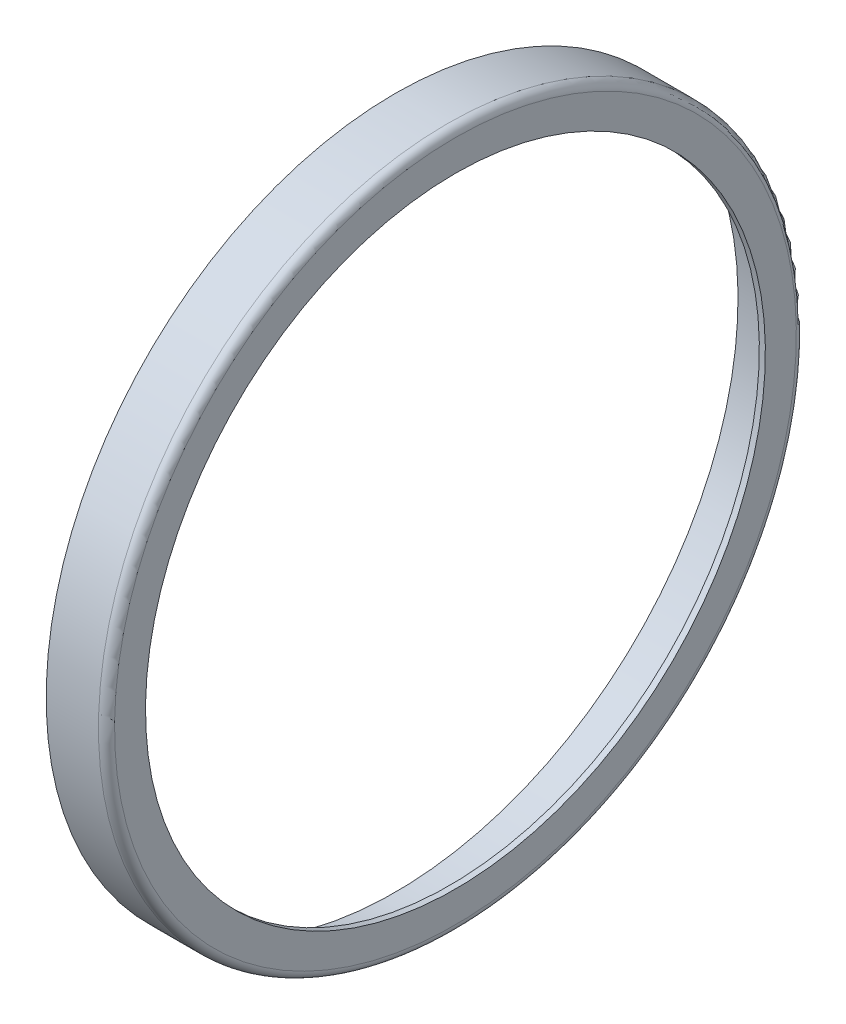
ISO-10303-21;
HEADER;
FILE_DESCRIPTION(('STEP AP214'),'2;1');
FILE_NAME('part.step','',(''),(''),'','','');
FILE_SCHEMA(('AUTOMOTIVE_DESIGN { 1 0 10303 214 1 1 1 1 }'));
ENDSEC;
DATA;
#1=APPLICATION_CONTEXT('core data for automotive mechanical design processes');
#2=APPLICATION_PROTOCOL_DEFINITION('international standard','automotive_design',2000,#1);
#3=PRODUCT_CONTEXT('',#1,'mechanical');
#4=PRODUCT('Part','Part','',(#3));
#5=PRODUCT_RELATED_PRODUCT_CATEGORY('part','',(#4));
#6=PRODUCT_DEFINITION_FORMATION('','',#4);
#7=PRODUCT_DEFINITION_CONTEXT('part definition',#1,'design');
#8=PRODUCT_DEFINITION('design','',#6,#7);
#9=PRODUCT_DEFINITION_SHAPE('','',#8);
#10=(LENGTH_UNIT() NAMED_UNIT(*) SI_UNIT(.MILLI.,.METRE.));
#11=(NAMED_UNIT(*) PLANE_ANGLE_UNIT() SI_UNIT($,.RADIAN.));
#12=(NAMED_UNIT(*) SI_UNIT($,.STERADIAN.) SOLID_ANGLE_UNIT());
#13=UNCERTAINTY_MEASURE_WITH_UNIT(LENGTH_MEASURE(1.E-05),#10,'distance_accuracy_value','');
#14=(GEOMETRIC_REPRESENTATION_CONTEXT(3) GLOBAL_UNCERTAINTY_ASSIGNED_CONTEXT((#13)) GLOBAL_UNIT_ASSIGNED_CONTEXT((#10,
#11,#12)) REPRESENTATION_CONTEXT('',''));
#15=CARTESIAN_POINT('',(0.,0.,0.));
#16=DIRECTION('',(0.,0.,1.));
#17=DIRECTION('',(1.,0.,0.));
#18=AXIS2_PLACEMENT_3D('',#15,#16,#17);
#19=CARTESIAN_POINT('',(27.775,0.,0.));
#20=DIRECTION('',(-1.,0.,0.));
#21=DIRECTION('',(0.,1.,0.));
#22=AXIS2_PLACEMENT_3D('',#19,#20,#21);
#23=CYLINDRICAL_SURFACE('',#22,23.125);
#24=CARTESIAN_POINT('',(28.,0.,0.));
#25=DIRECTION('',(1.,0.,0.));
#26=DIRECTION('',(0.,1.,0.));
#27=AXIS2_PLACEMENT_3D('',#24,#25,#26);
#28=CIRCLE('',#27,23.125);
#29=CARTESIAN_POINT('',(28.,23.125,0.));
#30=VERTEX_POINT('',#29);
#31=EDGE_CURVE('E11',#30,#30,#28,.T.);
#32=ORIENTED_EDGE('',*,*,#31,.T.);
#33=EDGE_LOOP('',(#32));
#34=FACE_BOUND('',#33,.T.);
#35=CARTESIAN_POINT('',(27.55,0.,0.));
#36=DIRECTION('',(1.,0.,0.));
#37=DIRECTION('',(0.,1.,0.));
#38=AXIS2_PLACEMENT_3D('',#35,#36,#37);
#39=CIRCLE('',#38,23.125);
#40=CARTESIAN_POINT('',(27.55,23.125,0.));
#41=VERTEX_POINT('',#40);
#42=EDGE_CURVE('E51',#41,#41,#39,.T.);
#43=ORIENTED_EDGE('',*,*,#42,.F.);
#44=EDGE_LOOP('',(#43));
#45=FACE_BOUND('',#44,.T.);
#46=ADVANCED_FACE('F17',(#34,#45),#23,.F.);
#47=CARTESIAN_POINT('',(28.,24.28,0.));
#48=DIRECTION('',(1.,0.,0.));
#49=DIRECTION('',(0.,1.,0.));
#50=AXIS2_PLACEMENT_3D('',#47,#48,#49);
#51=PLANE('',#50);
#52=CARTESIAN_POINT('',(28.,0.,0.));
#53=DIRECTION('',(1.,0.,0.));
#54=DIRECTION('',(0.,1.,0.));
#55=AXIS2_PLACEMENT_3D('',#52,#53,#54);
#56=CIRCLE('',#55,25.435);
#57=CARTESIAN_POINT('',(28.,25.435,0.));
#58=VERTEX_POINT('',#57);
#59=EDGE_CURVE('E26',#58,#58,#56,.T.);
#60=ORIENTED_EDGE('',*,*,#59,.T.);
#61=EDGE_LOOP('',(#60));
#62=FACE_BOUND('',#61,.T.);
#63=ORIENTED_EDGE('',*,*,#31,.F.);
#64=EDGE_LOOP('',(#63));
#65=FACE_BOUND('',#64,.T.);
#66=ADVANCED_FACE('F91',(#62,#65),#51,.T.);
#67=CARTESIAN_POINT('',(27.4,0.,0.));
#68=DIRECTION('',(1.,0.,0.));
#69=DIRECTION('',(0.,0.,-1.));
#70=AXIS2_PLACEMENT_3D('',#67,#68,#69);
#71=TOROIDAL_SURFACE('',#70,25.435,0.6);
#72=CARTESIAN_POINT('',(27.4,0.,0.));
#73=DIRECTION('',(1.,0.,0.));
#74=DIRECTION('',(0.,1.,0.));
#75=AXIS2_PLACEMENT_3D('',#72,#73,#74);
#76=CIRCLE('',#75,26.035);
#77=CARTESIAN_POINT('',(27.4,26.035,0.));
#78=VERTEX_POINT('',#77);
#79=EDGE_CURVE('E59',#78,#78,#76,.T.);
#80=ORIENTED_EDGE('',*,*,#79,.T.);
#81=EDGE_LOOP('',(#80));
#82=FACE_BOUND('',#81,.T.);
#83=ORIENTED_EDGE('',*,*,#59,.F.);
#84=EDGE_LOOP('',(#83));
#85=FACE_BOUND('',#84,.T.);
#86=ADVANCED_FACE('F60',(#82,#85),#71,.T.);
#87=CARTESIAN_POINT('',(25.45,0.,0.));
#88=DIRECTION('',(-1.,0.,0.));
#89=DIRECTION('',(0.,1.,0.));
#90=AXIS2_PLACEMENT_3D('',#87,#88,#89);
#91=CYLINDRICAL_SURFACE('',#90,26.035);
#92=CARTESIAN_POINT('',(23.5,0.,0.));
#93=DIRECTION('',(1.,0.,0.));
#94=DIRECTION('',(0.,1.,0.));
#95=AXIS2_PLACEMENT_3D('',#92,#93,#94);
#96=CIRCLE('',#95,26.035);
#97=CARTESIAN_POINT('',(23.5,26.035,0.));
#98=VERTEX_POINT('',#97);
#99=EDGE_CURVE('E63',#98,#98,#96,.T.);
#100=ORIENTED_EDGE('',*,*,#99,.T.);
#101=EDGE_LOOP('',(#100));
#102=FACE_BOUND('',#101,.T.);
#103=ORIENTED_EDGE('',*,*,#79,.F.);
#104=EDGE_LOOP('',(#103));
#105=FACE_BOUND('',#104,.T.);
#106=ADVANCED_FACE('F86',(#102,#105),#91,.T.);
#107=CARTESIAN_POINT('',(23.5,25.81,0.));
#108=DIRECTION('',(-1.,0.,0.));
#109=DIRECTION('',(0.,-1.,0.));
#110=AXIS2_PLACEMENT_3D('',#107,#108,#109);
#111=PLANE('',#110);
#112=CARTESIAN_POINT('',(23.5,0.,0.));
#113=DIRECTION('',(1.,0.,0.));
#114=DIRECTION('',(0.,1.,0.));
#115=AXIS2_PLACEMENT_3D('',#112,#113,#114);
#116=CIRCLE('',#115,25.585);
#117=CARTESIAN_POINT('',(23.5,25.585,0.));
#118=VERTEX_POINT('',#117);
#119=EDGE_CURVE('E66',#118,#118,#116,.T.);
#120=ORIENTED_EDGE('',*,*,#119,.T.);
#121=EDGE_LOOP('',(#120));
#122=FACE_BOUND('',#121,.T.);
#123=ORIENTED_EDGE('',*,*,#99,.F.);
#124=EDGE_LOOP('',(#123));
#125=FACE_BOUND('',#124,.T.);
#126=ADVANCED_FACE('F72',(#122,#125),#111,.T.);
#127=CARTESIAN_POINT('',(25.375,0.,0.));
#128=DIRECTION('',(-1.,0.,0.));
#129=DIRECTION('',(0.,1.,0.));
#130=AXIS2_PLACEMENT_3D('',#127,#128,#129);
#131=CYLINDRICAL_SURFACE('',#130,25.585);
#132=CARTESIAN_POINT('',(27.25,0.,0.));
#133=DIRECTION('',(1.,0.,0.));
#134=DIRECTION('',(0.,1.,0.));
#135=AXIS2_PLACEMENT_3D('',#132,#133,#134);
#136=CIRCLE('',#135,25.585);
#137=CARTESIAN_POINT('',(27.25,25.585,0.));
#138=VERTEX_POINT('',#137);
#139=EDGE_CURVE('E45',#138,#138,#136,.T.);
#140=ORIENTED_EDGE('',*,*,#139,.T.);
#141=EDGE_LOOP('',(#140));
#142=FACE_BOUND('',#141,.T.);
#143=ORIENTED_EDGE('',*,*,#119,.F.);
#144=EDGE_LOOP('',(#143));
#145=FACE_BOUND('',#144,.T.);
#146=ADVANCED_FACE('F75',(#142,#145),#131,.F.);
#147=CARTESIAN_POINT('',(27.25,0.,0.));
#148=DIRECTION('',(1.,0.,0.));
#149=DIRECTION('',(0.,0.,-1.));
#150=AXIS2_PLACEMENT_3D('',#147,#148,#149);
#151=TOROIDAL_SURFACE('',#150,25.285,0.3);
#152=CARTESIAN_POINT('',(27.55,0.,0.));
#153=DIRECTION('',(1.,0.,0.));
#154=DIRECTION('',(0.,1.,0.));
#155=AXIS2_PLACEMENT_3D('',#152,#153,#154);
#156=CIRCLE('',#155,25.285);
#157=CARTESIAN_POINT('',(27.55,25.285,0.));
#158=VERTEX_POINT('',#157);
#159=EDGE_CURVE('E20',#158,#158,#156,.T.);
#160=ORIENTED_EDGE('',*,*,#159,.T.);
#161=EDGE_LOOP('',(#160));
#162=FACE_BOUND('',#161,.T.);
#163=ORIENTED_EDGE('',*,*,#139,.F.);
#164=EDGE_LOOP('',(#163));
#165=FACE_BOUND('',#164,.T.);
#166=ADVANCED_FACE('F77',(#162,#165),#151,.F.);
#167=CARTESIAN_POINT('',(27.55,24.205,0.));
#168=DIRECTION('',(-1.,0.,0.));
#169=DIRECTION('',(0.,-1.,0.));
#170=AXIS2_PLACEMENT_3D('',#167,#168,#169);
#171=PLANE('',#170);
#172=ORIENTED_EDGE('',*,*,#42,.T.);
#173=EDGE_LOOP('',(#172));
#174=FACE_BOUND('',#173,.T.);
#175=ORIENTED_EDGE('',*,*,#159,.F.);
#176=EDGE_LOOP('',(#175));
#177=FACE_BOUND('',#176,.T.);
#178=ADVANCED_FACE('F84',(#174,#177),#171,.T.);
#179=CLOSED_SHELL('',(#46,#66,#86,#106,#126,#146,#166,#178));
#180=MANIFOLD_SOLID_BREP('B1',#179);
#181=ADVANCED_BREP_SHAPE_REPRESENTATION('',(#18,#180),#14);
#182=SHAPE_DEFINITION_REPRESENTATION(#9,#181);
ENDSEC;
END-ISO-10303-21;
